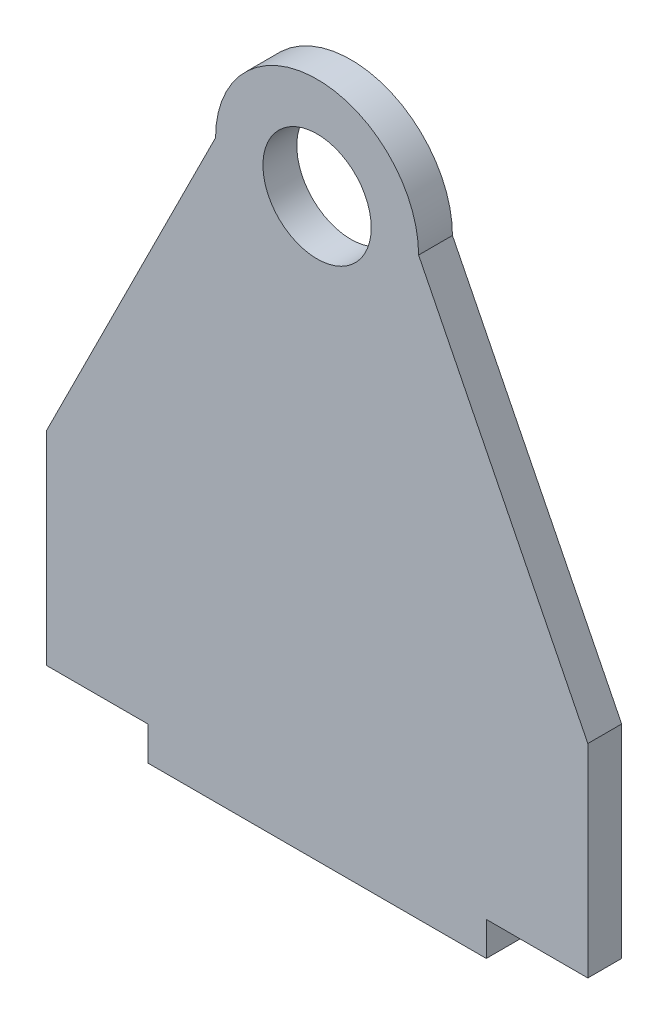
ISO-10303-21;
HEADER;
FILE_DESCRIPTION(('STEP AP214'),'2;1');
FILE_NAME('part.step','',(''),(''),'','','');
FILE_SCHEMA(('AUTOMOTIVE_DESIGN { 1 0 10303 214 1 1 1 1 }'));
ENDSEC;
DATA;
#1=APPLICATION_CONTEXT('core data for automotive mechanical design processes');
#2=APPLICATION_PROTOCOL_DEFINITION('international standard','automotive_design',2000,#1);
#3=PRODUCT_CONTEXT('',#1,'mechanical');
#4=PRODUCT('Part','Part','',(#3));
#5=PRODUCT_RELATED_PRODUCT_CATEGORY('part','',(#4));
#6=PRODUCT_DEFINITION_FORMATION('','',#4);
#7=PRODUCT_DEFINITION_CONTEXT('part definition',#1,'design');
#8=PRODUCT_DEFINITION('design','',#6,#7);
#9=PRODUCT_DEFINITION_SHAPE('','',#8);
#10=(LENGTH_UNIT() NAMED_UNIT(*) SI_UNIT(.MILLI.,.METRE.));
#11=(NAMED_UNIT(*) PLANE_ANGLE_UNIT() SI_UNIT($,.RADIAN.));
#12=(NAMED_UNIT(*) SI_UNIT($,.STERADIAN.) SOLID_ANGLE_UNIT());
#13=UNCERTAINTY_MEASURE_WITH_UNIT(LENGTH_MEASURE(1.E-05),#10,'distance_accuracy_value','');
#14=(GEOMETRIC_REPRESENTATION_CONTEXT(3) GLOBAL_UNCERTAINTY_ASSIGNED_CONTEXT((#13)) GLOBAL_UNIT_ASSIGNED_CONTEXT((#10,
#11,#12)) REPRESENTATION_CONTEXT('',''));
#15=CARTESIAN_POINT('',(0.,0.,0.));
#16=DIRECTION('',(0.,0.,1.));
#17=DIRECTION('',(1.,0.,0.));
#18=AXIS2_PLACEMENT_3D('',#15,#16,#17);
#19=CARTESIAN_POINT('',(0.,0.,5.));
#20=DIRECTION('',(0.,0.,1.));
#21=DIRECTION('',(1.,0.,0.));
#22=AXIS2_PLACEMENT_3D('',#19,#20,#21);
#23=PLANE('',#22);
#24=DIRECTION('',(0.,-1.,0.));
#25=VECTOR('',#24,1.);
#26=CARTESIAN_POINT('',(-25.,-80.,5.));
#27=LINE('',#26,#25);
#28=CARTESIAN_POINT('',(-25.,-80.,5.));
#29=VERTEX_POINT('',#28);
#30=CARTESIAN_POINT('',(-25.,-85.,5.));
#31=VERTEX_POINT('',#30);
#32=EDGE_CURVE('E159',#29,#31,#27,.T.);
#33=ORIENTED_EDGE('',*,*,#32,.T.);
#34=DIRECTION('',(1.,0.,0.));
#35=VECTOR('',#34,1.);
#36=CARTESIAN_POINT('',(-25.,-85.,5.));
#37=LINE('',#36,#35);
#38=CARTESIAN_POINT('',(25.,-85.,5.));
#39=VERTEX_POINT('',#38);
#40=EDGE_CURVE('E97',#31,#39,#37,.T.);
#41=ORIENTED_EDGE('',*,*,#40,.T.);
#42=DIRECTION('',(0.,1.,0.));
#43=VECTOR('',#42,1.);
#44=CARTESIAN_POINT('',(25.,-80.,5.));
#45=LINE('',#44,#43);
#46=CARTESIAN_POINT('',(25.,-80.,5.));
#47=VERTEX_POINT('',#46);
#48=EDGE_CURVE('E180',#39,#47,#45,.T.);
#49=ORIENTED_EDGE('',*,*,#48,.T.);
#50=DIRECTION('',(1.,0.,0.));
#51=VECTOR('',#50,1.);
#52=CARTESIAN_POINT('',(25.,-80.,5.));
#53=LINE('',#52,#51);
#54=CARTESIAN_POINT('',(40.,-80.,5.));
#55=VERTEX_POINT('',#54);
#56=EDGE_CURVE('E199',#47,#55,#53,.T.);
#57=ORIENTED_EDGE('',*,*,#56,.T.);
#58=DIRECTION('',(0.,1.,0.));
#59=VECTOR('',#58,1.);
#60=CARTESIAN_POINT('',(40.,-80.,5.));
#61=LINE('',#60,#59);
#62=CARTESIAN_POINT('',(40.,-50.,5.));
#63=VERTEX_POINT('',#62);
#64=EDGE_CURVE('E196',#55,#63,#61,.T.);
#65=ORIENTED_EDGE('',*,*,#64,.T.);
#66=DIRECTION('',(-0.447213595499958,0.894427190999916,0.));
#67=VECTOR('',#66,1.);
#68=CARTESIAN_POINT('',(40.,-50.,5.));
#69=LINE('',#68,#67);
#70=CARTESIAN_POINT('',(15.,0.,5.));
#71=VERTEX_POINT('',#70);
#72=EDGE_CURVE('E198',#63,#71,#69,.T.);
#73=ORIENTED_EDGE('',*,*,#72,.T.);
#74=CARTESIAN_POINT('',(0.,0.,5.));
#75=DIRECTION('',(0.,0.,1.));
#76=DIRECTION('',(1.,0.,0.));
#77=AXIS2_PLACEMENT_3D('',#74,#75,#76);
#78=CIRCLE('',#77,15.);
#79=CARTESIAN_POINT('',(-15.,0.,5.));
#80=VERTEX_POINT('',#79);
#81=EDGE_CURVE('E122',#71,#80,#78,.T.);
#82=ORIENTED_EDGE('',*,*,#81,.T.);
#83=DIRECTION('',(-0.447213595499958,-0.894427190999916,0.));
#84=VECTOR('',#83,1.);
#85=CARTESIAN_POINT('',(-40.,-50.,5.));
#86=LINE('',#85,#84);
#87=CARTESIAN_POINT('',(-40.,-50.,5.));
#88=VERTEX_POINT('',#87);
#89=EDGE_CURVE('E116',#80,#88,#86,.T.);
#90=ORIENTED_EDGE('',*,*,#89,.T.);
#91=DIRECTION('',(0.,-1.,0.));
#92=VECTOR('',#91,1.);
#93=CARTESIAN_POINT('',(-40.,-80.,5.));
#94=LINE('',#93,#92);
#95=CARTESIAN_POINT('',(-40.,-80.,5.));
#96=VERTEX_POINT('',#95);
#97=EDGE_CURVE('E120',#88,#96,#94,.T.);
#98=ORIENTED_EDGE('',*,*,#97,.T.);
#99=DIRECTION('',(1.,0.,0.));
#100=VECTOR('',#99,1.);
#101=CARTESIAN_POINT('',(-40.,-80.,5.));
#102=LINE('',#101,#100);
#103=EDGE_CURVE('E48',#96,#29,#102,.T.);
#104=ORIENTED_EDGE('',*,*,#103,.T.);
#105=EDGE_LOOP('',(#33,#41,#49,#57,#65,#73,#82,#90,#98,#104));
#106=FACE_BOUND('',#105,.T.);
#107=CARTESIAN_POINT('',(0.,0.,5.));
#108=DIRECTION('',(0.,0.,1.));
#109=DIRECTION('',(1.,0.,0.));
#110=AXIS2_PLACEMENT_3D('',#107,#108,#109);
#111=CIRCLE('',#110,8.);
#112=CARTESIAN_POINT('',(8.,0.,5.));
#113=VERTEX_POINT('',#112);
#114=EDGE_CURVE('E144',#113,#113,#111,.T.);
#115=ORIENTED_EDGE('',*,*,#114,.F.);
#116=EDGE_LOOP('',(#115));
#117=FACE_BOUND('',#116,.T.);
#118=ADVANCED_FACE('F31',(#106,#117),#23,.T.);
#119=CARTESIAN_POINT('',(0.,0.,0.));
#120=DIRECTION('',(0.,0.,1.));
#121=DIRECTION('',(1.,0.,0.));
#122=AXIS2_PLACEMENT_3D('',#119,#120,#121);
#123=PLANE('',#122);
#124=DIRECTION('',(0.,-1.,0.));
#125=VECTOR('',#124,1.);
#126=CARTESIAN_POINT('',(-25.,-80.,0.));
#127=LINE('',#126,#125);
#128=CARTESIAN_POINT('',(-25.,-80.,0.));
#129=VERTEX_POINT('',#128);
#130=CARTESIAN_POINT('',(-25.,-85.,0.));
#131=VERTEX_POINT('',#130);
#132=EDGE_CURVE('E140',#129,#131,#127,.T.);
#133=ORIENTED_EDGE('',*,*,#132,.F.);
#134=DIRECTION('',(1.,0.,0.));
#135=VECTOR('',#134,1.);
#136=CARTESIAN_POINT('',(-40.,-80.,0.));
#137=LINE('',#136,#135);
#138=CARTESIAN_POINT('',(-40.,-80.,0.));
#139=VERTEX_POINT('',#138);
#140=EDGE_CURVE('E89',#139,#129,#137,.T.);
#141=ORIENTED_EDGE('',*,*,#140,.F.);
#142=DIRECTION('',(0.,-1.,0.));
#143=VECTOR('',#142,1.);
#144=CARTESIAN_POINT('',(-40.,-80.,0.));
#145=LINE('',#144,#143);
#146=CARTESIAN_POINT('',(-40.,-50.,0.));
#147=VERTEX_POINT('',#146);
#148=EDGE_CURVE('E83',#147,#139,#145,.T.);
#149=ORIENTED_EDGE('',*,*,#148,.F.);
#150=DIRECTION('',(-0.447213595499958,-0.894427190999916,0.));
#151=VECTOR('',#150,1.);
#152=CARTESIAN_POINT('',(-40.,-50.,0.));
#153=LINE('',#152,#151);
#154=CARTESIAN_POINT('',(-15.,0.,0.));
#155=VERTEX_POINT('',#154);
#156=EDGE_CURVE('E130',#155,#147,#153,.T.);
#157=ORIENTED_EDGE('',*,*,#156,.F.);
#158=CARTESIAN_POINT('',(0.,0.,0.));
#159=DIRECTION('',(0.,0.,1.));
#160=DIRECTION('',(1.,0.,0.));
#161=AXIS2_PLACEMENT_3D('',#158,#159,#160);
#162=CIRCLE('',#161,15.);
#163=CARTESIAN_POINT('',(15.,0.,0.));
#164=VERTEX_POINT('',#163);
#165=EDGE_CURVE('E154',#164,#155,#162,.T.);
#166=ORIENTED_EDGE('',*,*,#165,.F.);
#167=DIRECTION('',(-0.447213595499958,0.894427190999916,0.));
#168=VECTOR('',#167,1.);
#169=CARTESIAN_POINT('',(40.,-50.,0.));
#170=LINE('',#169,#168);
#171=CARTESIAN_POINT('',(40.,-50.,0.));
#172=VERTEX_POINT('',#171);
#173=EDGE_CURVE('E152',#172,#164,#170,.T.);
#174=ORIENTED_EDGE('',*,*,#173,.F.);
#175=DIRECTION('',(0.,1.,0.));
#176=VECTOR('',#175,1.);
#177=CARTESIAN_POINT('',(40.,-80.,0.));
#178=LINE('',#177,#176);
#179=CARTESIAN_POINT('',(40.,-80.,0.));
#180=VERTEX_POINT('',#179);
#181=EDGE_CURVE('E150',#180,#172,#178,.T.);
#182=ORIENTED_EDGE('',*,*,#181,.F.);
#183=DIRECTION('',(1.,0.,0.));
#184=VECTOR('',#183,1.);
#185=CARTESIAN_POINT('',(25.,-80.,0.));
#186=LINE('',#185,#184);
#187=CARTESIAN_POINT('',(25.,-80.,0.));
#188=VERTEX_POINT('',#187);
#189=EDGE_CURVE('E148',#188,#180,#186,.T.);
#190=ORIENTED_EDGE('',*,*,#189,.F.);
#191=DIRECTION('',(0.,1.,0.));
#192=VECTOR('',#191,1.);
#193=CARTESIAN_POINT('',(25.,-80.,0.));
#194=LINE('',#193,#192);
#195=CARTESIAN_POINT('',(25.,-85.,0.));
#196=VERTEX_POINT('',#195);
#197=EDGE_CURVE('E146',#196,#188,#194,.T.);
#198=ORIENTED_EDGE('',*,*,#197,.F.);
#199=DIRECTION('',(1.,0.,0.));
#200=VECTOR('',#199,1.);
#201=CARTESIAN_POINT('',(-25.,-85.,0.));
#202=LINE('',#201,#200);
#203=EDGE_CURVE('E143',#131,#196,#202,.T.);
#204=ORIENTED_EDGE('',*,*,#203,.F.);
#205=EDGE_LOOP('',(#133,#141,#149,#157,#166,#174,#182,#190,#198,#204));
#206=FACE_BOUND('',#205,.T.);
#207=CARTESIAN_POINT('',(0.,0.,0.));
#208=DIRECTION('',(0.,0.,1.));
#209=DIRECTION('',(1.,0.,0.));
#210=AXIS2_PLACEMENT_3D('',#207,#208,#209);
#211=CIRCLE('',#210,8.);
#212=CARTESIAN_POINT('',(8.,0.,0.));
#213=VERTEX_POINT('',#212);
#214=EDGE_CURVE('E207',#213,#213,#211,.T.);
#215=ORIENTED_EDGE('',*,*,#214,.T.);
#216=EDGE_LOOP('',(#215));
#217=FACE_BOUND('',#216,.T.);
#218=ADVANCED_FACE('F184',(#206,#217),#123,.F.);
#219=CARTESIAN_POINT('',(-25.,-80.,5.));
#220=DIRECTION('',(1.,0.,0.));
#221=DIRECTION('',(0.,0.,-1.));
#222=AXIS2_PLACEMENT_3D('',#219,#220,#221);
#223=PLANE('',#222);
#224=ORIENTED_EDGE('',*,*,#132,.T.);
#225=DIRECTION('',(0.,0.,-1.));
#226=VECTOR('',#225,1.);
#227=CARTESIAN_POINT('',(-25.,-85.,5.));
#228=LINE('',#227,#226);
#229=EDGE_CURVE('E11',#31,#131,#228,.T.);
#230=ORIENTED_EDGE('',*,*,#229,.F.);
#231=ORIENTED_EDGE('',*,*,#32,.F.);
#232=DIRECTION('',(0.,0.,-1.));
#233=VECTOR('',#232,1.);
#234=CARTESIAN_POINT('',(-25.,-80.,5.));
#235=LINE('',#234,#233);
#236=EDGE_CURVE('E136',#29,#129,#235,.T.);
#237=ORIENTED_EDGE('',*,*,#236,.T.);
#238=EDGE_LOOP('',(#224,#230,#231,#237));
#239=FACE_BOUND('',#238,.T.);
#240=ADVANCED_FACE('F33',(#239),#223,.F.);
#241=CARTESIAN_POINT('',(-25.,-85.,5.));
#242=DIRECTION('',(0.,1.,0.));
#243=DIRECTION('',(0.,0.,1.));
#244=AXIS2_PLACEMENT_3D('',#241,#242,#243);
#245=PLANE('',#244);
#246=ORIENTED_EDGE('',*,*,#203,.T.);
#247=DIRECTION('',(0.,0.,-1.));
#248=VECTOR('',#247,1.);
#249=CARTESIAN_POINT('',(25.,-85.,5.));
#250=LINE('',#249,#248);
#251=EDGE_CURVE('E40',#39,#196,#250,.T.);
#252=ORIENTED_EDGE('',*,*,#251,.F.);
#253=ORIENTED_EDGE('',*,*,#40,.F.);
#254=ORIENTED_EDGE('',*,*,#229,.T.);
#255=EDGE_LOOP('',(#246,#252,#253,#254));
#256=FACE_BOUND('',#255,.T.);
#257=ADVANCED_FACE('F243',(#256),#245,.F.);
#258=CARTESIAN_POINT('',(25.,-80.,5.));
#259=DIRECTION('',(-1.,0.,0.));
#260=DIRECTION('',(0.,0.,1.));
#261=AXIS2_PLACEMENT_3D('',#258,#259,#260);
#262=PLANE('',#261);
#263=ORIENTED_EDGE('',*,*,#197,.T.);
#264=DIRECTION('',(0.,0.,-1.));
#265=VECTOR('',#264,1.);
#266=CARTESIAN_POINT('',(25.,-80.,5.));
#267=LINE('',#266,#265);
#268=EDGE_CURVE('E172',#47,#188,#267,.T.);
#269=ORIENTED_EDGE('',*,*,#268,.F.);
#270=ORIENTED_EDGE('',*,*,#48,.F.);
#271=ORIENTED_EDGE('',*,*,#251,.T.);
#272=EDGE_LOOP('',(#263,#269,#270,#271));
#273=FACE_BOUND('',#272,.T.);
#274=ADVANCED_FACE('F178',(#273),#262,.F.);
#275=CARTESIAN_POINT('',(25.,-80.,5.));
#276=DIRECTION('',(0.,1.,0.));
#277=DIRECTION('',(0.,0.,1.));
#278=AXIS2_PLACEMENT_3D('',#275,#276,#277);
#279=PLANE('',#278);
#280=ORIENTED_EDGE('',*,*,#189,.T.);
#281=DIRECTION('',(0.,0.,-1.));
#282=VECTOR('',#281,1.);
#283=CARTESIAN_POINT('',(40.,-80.,5.));
#284=LINE('',#283,#282);
#285=EDGE_CURVE('E169',#55,#180,#284,.T.);
#286=ORIENTED_EDGE('',*,*,#285,.F.);
#287=ORIENTED_EDGE('',*,*,#56,.F.);
#288=ORIENTED_EDGE('',*,*,#268,.T.);
#289=EDGE_LOOP('',(#280,#286,#287,#288));
#290=FACE_BOUND('',#289,.T.);
#291=ADVANCED_FACE('F190',(#290),#279,.F.);
#292=CARTESIAN_POINT('',(40.,-80.,5.));
#293=DIRECTION('',(-1.,0.,0.));
#294=DIRECTION('',(0.,0.,1.));
#295=AXIS2_PLACEMENT_3D('',#292,#293,#294);
#296=PLANE('',#295);
#297=ORIENTED_EDGE('',*,*,#181,.T.);
#298=DIRECTION('',(0.,0.,-1.));
#299=VECTOR('',#298,1.);
#300=CARTESIAN_POINT('',(40.,-50.,5.));
#301=LINE('',#300,#299);
#302=EDGE_CURVE('E166',#63,#172,#301,.T.);
#303=ORIENTED_EDGE('',*,*,#302,.F.);
#304=ORIENTED_EDGE('',*,*,#64,.F.);
#305=ORIENTED_EDGE('',*,*,#285,.T.);
#306=EDGE_LOOP('',(#297,#303,#304,#305));
#307=FACE_BOUND('',#306,.T.);
#308=ADVANCED_FACE('F194',(#307),#296,.F.);
#309=CARTESIAN_POINT('',(40.,-50.,5.));
#310=DIRECTION('',(-0.894427190999916,-0.447213595499958,0.));
#311=DIRECTION('',(0.447213595499958,-0.894427190999916,0.));
#312=AXIS2_PLACEMENT_3D('',#309,#310,#311);
#313=PLANE('',#312);
#314=ORIENTED_EDGE('',*,*,#173,.T.);
#315=DIRECTION('',(0.,0.,-1.));
#316=VECTOR('',#315,1.);
#317=CARTESIAN_POINT('',(15.,0.,5.));
#318=LINE('',#317,#316);
#319=EDGE_CURVE('E163',#71,#164,#318,.T.);
#320=ORIENTED_EDGE('',*,*,#319,.F.);
#321=ORIENTED_EDGE('',*,*,#72,.F.);
#322=ORIENTED_EDGE('',*,*,#302,.T.);
#323=EDGE_LOOP('',(#314,#320,#321,#322));
#324=FACE_BOUND('',#323,.T.);
#325=ADVANCED_FACE('F233',(#324),#313,.F.);
#326=CARTESIAN_POINT('',(0.,0.,5.));
#327=DIRECTION('',(0.,0.,-1.));
#328=DIRECTION('',(-1.,0.,0.));
#329=AXIS2_PLACEMENT_3D('',#326,#327,#328);
#330=CYLINDRICAL_SURFACE('',#329,15.);
#331=ORIENTED_EDGE('',*,*,#165,.T.);
#332=DIRECTION('',(0.,0.,-1.));
#333=VECTOR('',#332,1.);
#334=CARTESIAN_POINT('',(-15.,0.,5.));
#335=LINE('',#334,#333);
#336=EDGE_CURVE('E131',#80,#155,#335,.T.);
#337=ORIENTED_EDGE('',*,*,#336,.F.);
#338=ORIENTED_EDGE('',*,*,#81,.F.);
#339=ORIENTED_EDGE('',*,*,#319,.T.);
#340=EDGE_LOOP('',(#331,#337,#338,#339));
#341=FACE_BOUND('',#340,.T.);
#342=ADVANCED_FACE('F230',(#341),#330,.T.);
#343=CARTESIAN_POINT('',(-40.,-50.,5.));
#344=DIRECTION('',(0.894427190999916,-0.447213595499958,0.));
#345=DIRECTION('',(0.447213595499958,0.894427190999916,0.));
#346=AXIS2_PLACEMENT_3D('',#343,#344,#345);
#347=PLANE('',#346);
#348=ORIENTED_EDGE('',*,*,#156,.T.);
#349=DIRECTION('',(0.,0.,-1.));
#350=VECTOR('',#349,1.);
#351=CARTESIAN_POINT('',(-40.,-50.,5.));
#352=LINE('',#351,#350);
#353=EDGE_CURVE('E127',#88,#147,#352,.T.);
#354=ORIENTED_EDGE('',*,*,#353,.F.);
#355=ORIENTED_EDGE('',*,*,#89,.F.);
#356=ORIENTED_EDGE('',*,*,#336,.T.);
#357=EDGE_LOOP('',(#348,#354,#355,#356));
#358=FACE_BOUND('',#357,.T.);
#359=ADVANCED_FACE('F128',(#358),#347,.F.);
#360=CARTESIAN_POINT('',(-40.,-80.,5.));
#361=DIRECTION('',(1.,0.,0.));
#362=DIRECTION('',(0.,0.,-1.));
#363=AXIS2_PLACEMENT_3D('',#360,#361,#362);
#364=PLANE('',#363);
#365=ORIENTED_EDGE('',*,*,#148,.T.);
#366=DIRECTION('',(0.,0.,-1.));
#367=VECTOR('',#366,1.);
#368=CARTESIAN_POINT('',(-40.,-80.,5.));
#369=LINE('',#368,#367);
#370=EDGE_CURVE('E132',#96,#139,#369,.T.);
#371=ORIENTED_EDGE('',*,*,#370,.F.);
#372=ORIENTED_EDGE('',*,*,#97,.F.);
#373=ORIENTED_EDGE('',*,*,#353,.T.);
#374=EDGE_LOOP('',(#365,#371,#372,#373));
#375=FACE_BOUND('',#374,.T.);
#376=ADVANCED_FACE('F134',(#375),#364,.F.);
#377=CARTESIAN_POINT('',(-40.,-80.,5.));
#378=DIRECTION('',(0.,1.,0.));
#379=DIRECTION('',(0.,0.,1.));
#380=AXIS2_PLACEMENT_3D('',#377,#378,#379);
#381=PLANE('',#380);
#382=ORIENTED_EDGE('',*,*,#140,.T.);
#383=ORIENTED_EDGE('',*,*,#236,.F.);
#384=ORIENTED_EDGE('',*,*,#103,.F.);
#385=ORIENTED_EDGE('',*,*,#370,.T.);
#386=EDGE_LOOP('',(#382,#383,#384,#385));
#387=FACE_BOUND('',#386,.T.);
#388=ADVANCED_FACE('F223',(#387),#381,.F.);
#389=CARTESIAN_POINT('',(0.,0.,5.));
#390=DIRECTION('',(0.,0.,-1.));
#391=DIRECTION('',(-1.,0.,0.));
#392=AXIS2_PLACEMENT_3D('',#389,#390,#391);
#393=CYLINDRICAL_SURFACE('',#392,8.);
#394=ORIENTED_EDGE('',*,*,#114,.T.);
#395=EDGE_LOOP('',(#394));
#396=FACE_BOUND('',#395,.T.);
#397=ORIENTED_EDGE('',*,*,#214,.F.);
#398=EDGE_LOOP('',(#397));
#399=FACE_BOUND('',#398,.T.);
#400=ADVANCED_FACE('F213',(#396,#399),#393,.F.);
#401=CLOSED_SHELL('',(#118,#218,#240,#257,#274,#291,#308,#325,#342,#359,#376,#388,#400));
#402=MANIFOLD_SOLID_BREP('B2',#401);
#403=ADVANCED_BREP_SHAPE_REPRESENTATION('',(#18,#402),#14);
#404=SHAPE_DEFINITION_REPRESENTATION(#9,#403);
ENDSEC;
END-ISO-10303-21;
